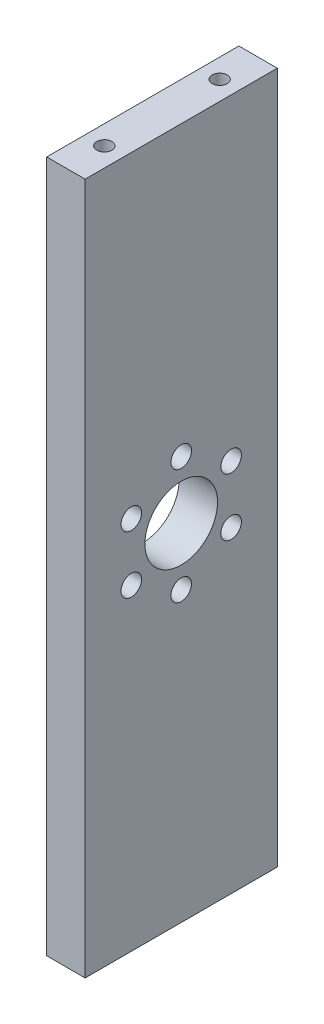
ISO-10303-21;
HEADER;
FILE_DESCRIPTION(('STEP AP214'),'2;1');
FILE_NAME('part.step','',(''),(''),'','','');
FILE_SCHEMA(('AUTOMOTIVE_DESIGN { 1 0 10303 214 1 1 1 1 }'));
ENDSEC;
DATA;
#1=APPLICATION_CONTEXT('core data for automotive mechanical design processes');
#2=APPLICATION_PROTOCOL_DEFINITION('international standard','automotive_design',2000,#1);
#3=PRODUCT_CONTEXT('',#1,'mechanical');
#4=PRODUCT('Part','Part','',(#3));
#5=PRODUCT_RELATED_PRODUCT_CATEGORY('part','',(#4));
#6=PRODUCT_DEFINITION_FORMATION('','',#4);
#7=PRODUCT_DEFINITION_CONTEXT('part definition',#1,'design');
#8=PRODUCT_DEFINITION('design','',#6,#7);
#9=PRODUCT_DEFINITION_SHAPE('','',#8);
#10=(LENGTH_UNIT() NAMED_UNIT(*) SI_UNIT(.MILLI.,.METRE.));
#11=(NAMED_UNIT(*) PLANE_ANGLE_UNIT() SI_UNIT($,.RADIAN.));
#12=(NAMED_UNIT(*) SI_UNIT($,.STERADIAN.) SOLID_ANGLE_UNIT());
#13=UNCERTAINTY_MEASURE_WITH_UNIT(LENGTH_MEASURE(1.E-05),#10,'distance_accuracy_value','');
#14=(GEOMETRIC_REPRESENTATION_CONTEXT(3) GLOBAL_UNCERTAINTY_ASSIGNED_CONTEXT((#13)) GLOBAL_UNIT_ASSIGNED_CONTEXT((#10,
#11,#12)) REPRESENTATION_CONTEXT('',''));
#15=CARTESIAN_POINT('',(0.,0.,0.));
#16=DIRECTION('',(0.,0.,1.));
#17=DIRECTION('',(1.,0.,0.));
#18=AXIS2_PLACEMENT_3D('',#15,#16,#17);
#19=CARTESIAN_POINT('',(3.175,-57.15,-15.875));
#20=DIRECTION('',(0.,0.,1.));
#21=DIRECTION('',(1.,0.,0.));
#22=AXIS2_PLACEMENT_3D('',#19,#20,#21);
#23=PLANE('',#22);
#24=DIRECTION('',(0.,1.,0.));
#25=VECTOR('',#24,1.);
#26=CARTESIAN_POINT('',(-3.175,-57.15,-15.875));
#27=LINE('',#26,#25);
#28=CARTESIAN_POINT('',(-3.175,-57.15,-15.875));
#29=VERTEX_POINT('',#28);
#30=CARTESIAN_POINT('',(-3.175,57.15,-15.875));
#31=VERTEX_POINT('',#30);
#32=EDGE_CURVE('E144',#29,#31,#27,.T.);
#33=ORIENTED_EDGE('',*,*,#32,.T.);
#34=DIRECTION('',(-1.,0.,0.));
#35=VECTOR('',#34,1.);
#36=CARTESIAN_POINT('',(3.175,57.15,-15.875));
#37=LINE('',#36,#35);
#38=CARTESIAN_POINT('',(3.175,57.15,-15.875));
#39=VERTEX_POINT('',#38);
#40=EDGE_CURVE('E11',#39,#31,#37,.T.);
#41=ORIENTED_EDGE('',*,*,#40,.F.);
#42=DIRECTION('',(0.,1.,0.));
#43=VECTOR('',#42,1.);
#44=CARTESIAN_POINT('',(3.175,-57.15,-15.875));
#45=LINE('',#44,#43);
#46=CARTESIAN_POINT('',(3.175,-57.15,-15.875));
#47=VERTEX_POINT('',#46);
#48=EDGE_CURVE('E145',#47,#39,#45,.T.);
#49=ORIENTED_EDGE('',*,*,#48,.F.);
#50=DIRECTION('',(-1.,0.,0.));
#51=VECTOR('',#50,1.);
#52=CARTESIAN_POINT('',(3.175,-57.15,-15.875));
#53=LINE('',#52,#51);
#54=EDGE_CURVE('E151',#47,#29,#53,.T.);
#55=ORIENTED_EDGE('',*,*,#54,.T.);
#56=EDGE_LOOP('',(#33,#41,#49,#55));
#57=FACE_BOUND('',#56,.T.);
#58=ADVANCED_FACE('F47',(#57),#23,.F.);
#59=CARTESIAN_POINT('',(3.175,57.15,15.875));
#60=DIRECTION('',(0.,-1.,0.));
#61=DIRECTION('',(0.,0.,-1.));
#62=AXIS2_PLACEMENT_3D('',#59,#60,#61);
#63=PLANE('',#62);
#64=CARTESIAN_POINT('',(0.,57.15,-9.525));
#65=DIRECTION('',(0.,1.,0.));
#66=DIRECTION('',(0.,0.,1.));
#67=AXIS2_PLACEMENT_3D('',#64,#65,#66);
#68=CIRCLE('',#67,1.25);
#69=CARTESIAN_POINT('',(0.,57.15,-8.275));
#70=VERTEX_POINT('',#69);
#71=EDGE_CURVE('E132',#70,#70,#68,.T.);
#72=ORIENTED_EDGE('',*,*,#71,.F.);
#73=EDGE_LOOP('',(#72));
#74=FACE_BOUND('',#73,.T.);
#75=CARTESIAN_POINT('',(0.,57.15,9.525));
#76=DIRECTION('',(0.,1.,0.));
#77=DIRECTION('',(0.,0.,1.));
#78=AXIS2_PLACEMENT_3D('',#75,#76,#77);
#79=CIRCLE('',#78,1.25);
#80=CARTESIAN_POINT('',(0.,57.15,10.775));
#81=VERTEX_POINT('',#80);
#82=EDGE_CURVE('E138',#81,#81,#79,.T.);
#83=ORIENTED_EDGE('',*,*,#82,.F.);
#84=EDGE_LOOP('',(#83));
#85=FACE_BOUND('',#84,.T.);
#86=DIRECTION('',(0.,0.,1.));
#87=VECTOR('',#86,1.);
#88=CARTESIAN_POINT('',(-3.175,57.15,15.875));
#89=LINE('',#88,#87);
#90=CARTESIAN_POINT('',(-3.175,57.15,15.875));
#91=VERTEX_POINT('',#90);
#92=EDGE_CURVE('E154',#31,#91,#89,.T.);
#93=ORIENTED_EDGE('',*,*,#92,.T.);
#94=DIRECTION('',(-1.,0.,0.));
#95=VECTOR('',#94,1.);
#96=CARTESIAN_POINT('',(3.175,57.15,15.875));
#97=LINE('',#96,#95);
#98=CARTESIAN_POINT('',(3.175,57.15,15.875));
#99=VERTEX_POINT('',#98);
#100=EDGE_CURVE('E56',#99,#91,#97,.T.);
#101=ORIENTED_EDGE('',*,*,#100,.F.);
#102=DIRECTION('',(0.,0.,1.));
#103=VECTOR('',#102,1.);
#104=CARTESIAN_POINT('',(3.175,57.15,15.875));
#105=LINE('',#104,#103);
#106=EDGE_CURVE('E96',#39,#99,#105,.T.);
#107=ORIENTED_EDGE('',*,*,#106,.F.);
#108=ORIENTED_EDGE('',*,*,#40,.T.);
#109=EDGE_LOOP('',(#93,#101,#107,#108));
#110=FACE_BOUND('',#109,.T.);
#111=ADVANCED_FACE('F251',(#74,#85,#110),#63,.F.);
#112=CARTESIAN_POINT('',(3.175,-57.15,15.875));
#113=DIRECTION('',(0.,0.,-1.));
#114=DIRECTION('',(-1.,0.,0.));
#115=AXIS2_PLACEMENT_3D('',#112,#113,#114);
#116=PLANE('',#115);
#117=DIRECTION('',(0.,-1.,0.));
#118=VECTOR('',#117,1.);
#119=CARTESIAN_POINT('',(-3.175,-57.15,15.875));
#120=LINE('',#119,#118);
#121=CARTESIAN_POINT('',(-3.175,-57.15,15.875));
#122=VERTEX_POINT('',#121);
#123=EDGE_CURVE('E83',#91,#122,#120,.T.);
#124=ORIENTED_EDGE('',*,*,#123,.T.);
#125=DIRECTION('',(-1.,0.,0.));
#126=VECTOR('',#125,1.);
#127=CARTESIAN_POINT('',(3.175,-57.15,15.875));
#128=LINE('',#127,#126);
#129=CARTESIAN_POINT('',(3.175,-57.15,15.875));
#130=VERTEX_POINT('',#129);
#131=EDGE_CURVE('E159',#130,#122,#128,.T.);
#132=ORIENTED_EDGE('',*,*,#131,.F.);
#133=DIRECTION('',(0.,-1.,0.));
#134=VECTOR('',#133,1.);
#135=CARTESIAN_POINT('',(3.175,-57.15,15.875));
#136=LINE('',#135,#134);
#137=EDGE_CURVE('E148',#99,#130,#136,.T.);
#138=ORIENTED_EDGE('',*,*,#137,.F.);
#139=ORIENTED_EDGE('',*,*,#100,.T.);
#140=EDGE_LOOP('',(#124,#132,#138,#139));
#141=FACE_BOUND('',#140,.T.);
#142=ADVANCED_FACE('F250',(#141),#116,.F.);
#143=CARTESIAN_POINT('',(3.175,-57.15,15.875));
#144=DIRECTION('',(0.,1.,0.));
#145=DIRECTION('',(0.,0.,1.));
#146=AXIS2_PLACEMENT_3D('',#143,#144,#145);
#147=PLANE('',#146);
#148=CARTESIAN_POINT('',(0.,-57.15,-9.525));
#149=DIRECTION('',(0.,-1.,0.));
#150=DIRECTION('',(0.,0.,-1.));
#151=AXIS2_PLACEMENT_3D('',#148,#149,#150);
#152=CIRCLE('',#151,1.25);
#153=CARTESIAN_POINT('',(0.,-57.15,-10.775));
#154=VERTEX_POINT('',#153);
#155=EDGE_CURVE('E120',#154,#154,#152,.T.);
#156=ORIENTED_EDGE('',*,*,#155,.F.);
#157=EDGE_LOOP('',(#156));
#158=FACE_BOUND('',#157,.T.);
#159=CARTESIAN_POINT('',(0.,-57.15,9.525));
#160=DIRECTION('',(0.,-1.,0.));
#161=DIRECTION('',(0.,0.,-1.));
#162=AXIS2_PLACEMENT_3D('',#159,#160,#161);
#163=CIRCLE('',#162,1.25);
#164=CARTESIAN_POINT('',(0.,-57.15,8.275));
#165=VERTEX_POINT('',#164);
#166=EDGE_CURVE('E119',#165,#165,#163,.T.);
#167=ORIENTED_EDGE('',*,*,#166,.F.);
#168=EDGE_LOOP('',(#167));
#169=FACE_BOUND('',#168,.T.);
#170=DIRECTION('',(0.,0.,-1.));
#171=VECTOR('',#170,1.);
#172=CARTESIAN_POINT('',(-3.175,-57.15,15.875));
#173=LINE('',#172,#171);
#174=EDGE_CURVE('E89',#122,#29,#173,.T.);
#175=ORIENTED_EDGE('',*,*,#174,.T.);
#176=ORIENTED_EDGE('',*,*,#54,.F.);
#177=DIRECTION('',(0.,0.,-1.));
#178=VECTOR('',#177,1.);
#179=CARTESIAN_POINT('',(3.175,-57.15,15.875));
#180=LINE('',#179,#178);
#181=EDGE_CURVE('E65',#130,#47,#180,.T.);
#182=ORIENTED_EDGE('',*,*,#181,.F.);
#183=ORIENTED_EDGE('',*,*,#131,.T.);
#184=EDGE_LOOP('',(#175,#176,#182,#183));
#185=FACE_BOUND('',#184,.T.);
#186=ADVANCED_FACE('F248',(#158,#169,#185),#147,.F.);
#187=CARTESIAN_POINT('',(3.175,0.,0.));
#188=DIRECTION('',(-1.,0.,0.));
#189=DIRECTION('',(0.,0.,1.));
#190=AXIS2_PLACEMENT_3D('',#187,#188,#189);
#191=PLANE('',#190);
#192=CARTESIAN_POINT('',(3.175,-4.76250000000013,8.24889197104677));
#193=DIRECTION('',(-1.,0.,0.));
#194=DIRECTION('',(0.,0.,1.));
#195=AXIS2_PLACEMENT_3D('',#192,#193,#194);
#196=CIRCLE('',#195,1.7);
#197=CARTESIAN_POINT('',(3.175,-4.76250000000013,9.94889197104677));
#198=VERTEX_POINT('',#197);
#199=EDGE_CURVE('E50',#198,#198,#196,.T.);
#200=ORIENTED_EDGE('',*,*,#199,.T.);
#201=EDGE_LOOP('',(#200));
#202=FACE_BOUND('',#201,.T.);
#203=CARTESIAN_POINT('',(3.175,4.76249999999982,8.2488919710468));
#204=DIRECTION('',(-1.,0.,0.));
#205=DIRECTION('',(0.,0.,1.));
#206=AXIS2_PLACEMENT_3D('',#203,#204,#205);
#207=CIRCLE('',#206,1.7);
#208=CARTESIAN_POINT('',(3.175,4.76249999999982,9.94889197104679));
#209=VERTEX_POINT('',#208);
#210=EDGE_CURVE('E181',#209,#209,#207,.T.);
#211=ORIENTED_EDGE('',*,*,#210,.T.);
#212=EDGE_LOOP('',(#211));
#213=FACE_BOUND('',#212,.T.);
#214=CARTESIAN_POINT('',(3.175,9.52500000000006,1.26704204273533E-13));
#215=DIRECTION('',(-1.,0.,0.));
#216=DIRECTION('',(0.,0.,1.));
#217=AXIS2_PLACEMENT_3D('',#214,#215,#216);
#218=CIRCLE('',#217,1.7);
#219=CARTESIAN_POINT('',(3.175,9.52500000000006,1.70000000000012));
#220=VERTEX_POINT('',#219);
#221=EDGE_CURVE('E177',#220,#220,#218,.T.);
#222=ORIENTED_EDGE('',*,*,#221,.T.);
#223=EDGE_LOOP('',(#222));
#224=FACE_BOUND('',#223,.T.);
#225=CARTESIAN_POINT('',(3.175,4.76249999999996,-8.24889197104677));
#226=DIRECTION('',(-1.,0.,0.));
#227=DIRECTION('',(0.,0.,1.));
#228=AXIS2_PLACEMENT_3D('',#225,#226,#227);
#229=CIRCLE('',#228,1.7);
#230=CARTESIAN_POINT('',(3.175,4.76249999999996,-6.54889197104677));
#231=VERTEX_POINT('',#230);
#232=EDGE_CURVE('E172',#231,#231,#229,.T.);
#233=ORIENTED_EDGE('',*,*,#232,.T.);
#234=EDGE_LOOP('',(#233));
#235=FACE_BOUND('',#234,.T.);
#236=CARTESIAN_POINT('',(3.175,-4.76249999999994,-8.24889197104695));
#237=DIRECTION('',(-1.,0.,0.));
#238=DIRECTION('',(0.,0.,1.));
#239=AXIS2_PLACEMENT_3D('',#236,#237,#238);
#240=CIRCLE('',#239,1.7);
#241=CARTESIAN_POINT('',(3.175,-4.76249999999994,-6.54889197104696));
#242=VERTEX_POINT('',#241);
#243=EDGE_CURVE('E167',#242,#242,#240,.T.);
#244=ORIENTED_EDGE('',*,*,#243,.T.);
#245=EDGE_LOOP('',(#244));
#246=FACE_BOUND('',#245,.T.);
#247=CARTESIAN_POINT('',(3.175,-9.5250000000001,-1.30902231909023E-13));
#248=DIRECTION('',(-1.,0.,0.));
#249=DIRECTION('',(0.,0.,1.));
#250=AXIS2_PLACEMENT_3D('',#247,#248,#249);
#251=CIRCLE('',#250,1.7);
#252=CARTESIAN_POINT('',(3.175,-9.5250000000001,1.69999999999987));
#253=VERTEX_POINT('',#252);
#254=EDGE_CURVE('E162',#253,#253,#251,.T.);
#255=ORIENTED_EDGE('',*,*,#254,.T.);
#256=EDGE_LOOP('',(#255));
#257=FACE_BOUND('',#256,.T.);
#258=CARTESIAN_POINT('',(3.175,-1.66539606842861E-13,0.));
#259=DIRECTION('',(-1.,0.,0.));
#260=DIRECTION('',(0.,0.,1.));
#261=AXIS2_PLACEMENT_3D('',#258,#259,#260);
#262=CIRCLE('',#261,6.);
#263=CARTESIAN_POINT('',(3.175,-1.66539606842861E-13,6.00000000000002));
#264=VERTEX_POINT('',#263);
#265=EDGE_CURVE('E126',#264,#264,#262,.T.);
#266=ORIENTED_EDGE('',*,*,#265,.T.);
#267=EDGE_LOOP('',(#266));
#268=FACE_BOUND('',#267,.T.);
#269=ORIENTED_EDGE('',*,*,#48,.T.);
#270=ORIENTED_EDGE('',*,*,#106,.T.);
#271=ORIENTED_EDGE('',*,*,#137,.T.);
#272=ORIENTED_EDGE('',*,*,#181,.T.);
#273=EDGE_LOOP('',(#269,#270,#271,#272));
#274=FACE_BOUND('',#273,.T.);
#275=ADVANCED_FACE('F229',(#202,#213,#224,#235,#246,#257,#268,#274),#191,.F.);
#276=CARTESIAN_POINT('',(-3.175,0.,0.));
#277=DIRECTION('',(-1.,0.,0.));
#278=DIRECTION('',(0.,0.,1.));
#279=AXIS2_PLACEMENT_3D('',#276,#277,#278);
#280=PLANE('',#279);
#281=CARTESIAN_POINT('',(-3.175,-4.76250000000013,8.24889197104677));
#282=DIRECTION('',(-1.,0.,0.));
#283=DIRECTION('',(0.,0.,1.));
#284=AXIS2_PLACEMENT_3D('',#281,#282,#283);
#285=CIRCLE('',#284,2.25);
#286=CARTESIAN_POINT('',(-3.175,-4.76250000000013,10.4988919710468));
#287=VERTEX_POINT('',#286);
#288=EDGE_CURVE('E370',#287,#287,#285,.T.);
#289=ORIENTED_EDGE('',*,*,#288,.F.);
#290=EDGE_LOOP('',(#289));
#291=FACE_BOUND('',#290,.T.);
#292=CARTESIAN_POINT('',(-3.175,4.76249999999982,8.2488919710468));
#293=DIRECTION('',(-1.,0.,0.));
#294=DIRECTION('',(0.,0.,1.));
#295=AXIS2_PLACEMENT_3D('',#292,#293,#294);
#296=CIRCLE('',#295,2.25);
#297=CARTESIAN_POINT('',(-3.175,4.76249999999982,10.4988919710468));
#298=VERTEX_POINT('',#297);
#299=EDGE_CURVE('E196',#298,#298,#296,.T.);
#300=ORIENTED_EDGE('',*,*,#299,.F.);
#301=EDGE_LOOP('',(#300));
#302=FACE_BOUND('',#301,.T.);
#303=CARTESIAN_POINT('',(-3.175,9.52500000000006,1.26704204273533E-13));
#304=DIRECTION('',(-1.,0.,0.));
#305=DIRECTION('',(0.,0.,1.));
#306=AXIS2_PLACEMENT_3D('',#303,#304,#305);
#307=CIRCLE('',#306,2.25);
#308=CARTESIAN_POINT('',(-3.175,9.52500000000006,2.25000000000012));
#309=VERTEX_POINT('',#308);
#310=EDGE_CURVE('E183',#309,#309,#307,.T.);
#311=ORIENTED_EDGE('',*,*,#310,.F.);
#312=EDGE_LOOP('',(#311));
#313=FACE_BOUND('',#312,.T.);
#314=CARTESIAN_POINT('',(-3.175,4.76249999999996,-8.24889197104677));
#315=DIRECTION('',(-1.,0.,0.));
#316=DIRECTION('',(0.,0.,1.));
#317=AXIS2_PLACEMENT_3D('',#314,#315,#316);
#318=CIRCLE('',#317,2.25);
#319=CARTESIAN_POINT('',(-3.175,4.76249999999996,-5.99889197104677));
#320=VERTEX_POINT('',#319);
#321=EDGE_CURVE('E179',#320,#320,#318,.T.);
#322=ORIENTED_EDGE('',*,*,#321,.F.);
#323=EDGE_LOOP('',(#322));
#324=FACE_BOUND('',#323,.T.);
#325=CARTESIAN_POINT('',(-3.175,-4.76249999999994,-8.24889197104695));
#326=DIRECTION('',(-1.,0.,0.));
#327=DIRECTION('',(0.,0.,1.));
#328=AXIS2_PLACEMENT_3D('',#325,#326,#327);
#329=CIRCLE('',#328,2.25);
#330=CARTESIAN_POINT('',(-3.175,-4.76249999999994,-5.99889197104696));
#331=VERTEX_POINT('',#330);
#332=EDGE_CURVE('E175',#331,#331,#329,.T.);
#333=ORIENTED_EDGE('',*,*,#332,.F.);
#334=EDGE_LOOP('',(#333));
#335=FACE_BOUND('',#334,.T.);
#336=CARTESIAN_POINT('',(-3.175,-9.5250000000001,-1.30902231909023E-13));
#337=DIRECTION('',(-1.,0.,0.));
#338=DIRECTION('',(0.,0.,1.));
#339=AXIS2_PLACEMENT_3D('',#336,#337,#338);
#340=CIRCLE('',#339,2.25);
#341=CARTESIAN_POINT('',(-3.175,-9.5250000000001,2.24999999999986));
#342=VERTEX_POINT('',#341);
#343=EDGE_CURVE('E170',#342,#342,#340,.T.);
#344=ORIENTED_EDGE('',*,*,#343,.F.);
#345=EDGE_LOOP('',(#344));
#346=FACE_BOUND('',#345,.T.);
#347=CARTESIAN_POINT('',(-3.175,-1.66539606842861E-13,0.));
#348=DIRECTION('',(-1.,0.,0.));
#349=DIRECTION('',(0.,0.,1.));
#350=AXIS2_PLACEMENT_3D('',#347,#348,#349);
#351=CIRCLE('',#350,5.99999999999999);
#352=CARTESIAN_POINT('',(-3.175,-1.66539606842861E-13,6.00000000000002));
#353=VERTEX_POINT('',#352);
#354=EDGE_CURVE('E165',#353,#353,#351,.T.);
#355=ORIENTED_EDGE('',*,*,#354,.F.);
#356=EDGE_LOOP('',(#355));
#357=FACE_BOUND('',#356,.T.);
#358=ORIENTED_EDGE('',*,*,#32,.F.);
#359=ORIENTED_EDGE('',*,*,#174,.F.);
#360=ORIENTED_EDGE('',*,*,#123,.F.);
#361=ORIENTED_EDGE('',*,*,#92,.F.);
#362=EDGE_LOOP('',(#358,#359,#360,#361));
#363=FACE_BOUND('',#362,.T.);
#364=ADVANCED_FACE('F238',(#291,#302,#313,#324,#335,#346,#357,#363),#280,.T.);
#365=CARTESIAN_POINT('',(0.,44.45,9.525));
#366=DIRECTION('',(0.,1.,0.));
#367=DIRECTION('',(0.,0.,1.));
#368=AXIS2_PLACEMENT_3D('',#365,#366,#367);
#369=CONICAL_SURFACE('',#368,1.25,1.02974425867665);
#370=CARTESIAN_POINT('',(0.,43.6989242262155,9.525));
#371=VERTEX_POINT('',#370);
#372=VERTEX_LOOP('',#371);
#373=FACE_BOUND('',#372,.T.);
#374=CARTESIAN_POINT('',(0.,44.45,9.525));
#375=DIRECTION('',(0.,1.,0.));
#376=DIRECTION('',(0.,0.,1.));
#377=AXIS2_PLACEMENT_3D('',#374,#375,#376);
#378=CIRCLE('',#377,1.25);
#379=CARTESIAN_POINT('',(0.,44.45,10.775));
#380=VERTEX_POINT('',#379);
#381=EDGE_CURVE('E141',#380,#380,#378,.T.);
#382=ORIENTED_EDGE('',*,*,#381,.T.);
#383=EDGE_LOOP('',(#382));
#384=FACE_BOUND('',#383,.T.);
#385=ADVANCED_FACE('F241',(#373,#384),#369,.F.);
#386=CARTESIAN_POINT('',(0.,57.15,9.525));
#387=DIRECTION('',(0.,1.,0.));
#388=DIRECTION('',(0.,0.,1.));
#389=AXIS2_PLACEMENT_3D('',#386,#387,#388);
#390=CYLINDRICAL_SURFACE('',#389,1.25);
#391=ORIENTED_EDGE('',*,*,#381,.F.);
#392=EDGE_LOOP('',(#391));
#393=FACE_BOUND('',#392,.T.);
#394=ORIENTED_EDGE('',*,*,#82,.T.);
#395=EDGE_LOOP('',(#394));
#396=FACE_BOUND('',#395,.T.);
#397=ADVANCED_FACE('F271',(#393,#396),#390,.F.);
#398=CARTESIAN_POINT('',(0.,44.45,-9.525));
#399=DIRECTION('',(0.,1.,0.));
#400=DIRECTION('',(0.,0.,1.));
#401=AXIS2_PLACEMENT_3D('',#398,#399,#400);
#402=CONICAL_SURFACE('',#401,1.25,1.02974425867665);
#403=CARTESIAN_POINT('',(0.,43.6989242262155,-9.525));
#404=VERTEX_POINT('',#403);
#405=VERTEX_LOOP('',#404);
#406=FACE_BOUND('',#405,.T.);
#407=CARTESIAN_POINT('',(0.,44.45,-9.525));
#408=DIRECTION('',(0.,1.,0.));
#409=DIRECTION('',(0.,0.,1.));
#410=AXIS2_PLACEMENT_3D('',#407,#408,#409);
#411=CIRCLE('',#410,1.25);
#412=CARTESIAN_POINT('',(0.,44.45,-8.275));
#413=VERTEX_POINT('',#412);
#414=EDGE_CURVE('E135',#413,#413,#411,.T.);
#415=ORIENTED_EDGE('',*,*,#414,.T.);
#416=EDGE_LOOP('',(#415));
#417=FACE_BOUND('',#416,.T.);
#418=ADVANCED_FACE('F275',(#406,#417),#402,.F.);
#419=CARTESIAN_POINT('',(0.,57.15,-9.525));
#420=DIRECTION('',(0.,1.,0.));
#421=DIRECTION('',(0.,0.,1.));
#422=AXIS2_PLACEMENT_3D('',#419,#420,#421);
#423=CYLINDRICAL_SURFACE('',#422,1.25);
#424=ORIENTED_EDGE('',*,*,#414,.F.);
#425=EDGE_LOOP('',(#424));
#426=FACE_BOUND('',#425,.T.);
#427=ORIENTED_EDGE('',*,*,#71,.T.);
#428=EDGE_LOOP('',(#427));
#429=FACE_BOUND('',#428,.T.);
#430=ADVANCED_FACE('F279',(#426,#429),#423,.F.);
#431=CARTESIAN_POINT('',(0.,-44.45,9.525));
#432=DIRECTION('',(0.,-1.,0.));
#433=DIRECTION('',(0.,0.,-1.));
#434=AXIS2_PLACEMENT_3D('',#431,#432,#433);
#435=CONICAL_SURFACE('',#434,1.25,1.02974425867665);
#436=CARTESIAN_POINT('',(0.,-43.6989242262155,9.525));
#437=VERTEX_POINT('',#436);
#438=VERTEX_LOOP('',#437);
#439=FACE_BOUND('',#438,.T.);
#440=CARTESIAN_POINT('',(0.,-44.45,9.525));
#441=DIRECTION('',(0.,-1.,0.));
#442=DIRECTION('',(0.,0.,-1.));
#443=AXIS2_PLACEMENT_3D('',#440,#441,#442);
#444=CIRCLE('',#443,1.25);
#445=CARTESIAN_POINT('',(0.,-44.45,8.275));
#446=VERTEX_POINT('',#445);
#447=EDGE_CURVE('E123',#446,#446,#444,.T.);
#448=ORIENTED_EDGE('',*,*,#447,.T.);
#449=EDGE_LOOP('',(#448));
#450=FACE_BOUND('',#449,.T.);
#451=ADVANCED_FACE('F283',(#439,#450),#435,.F.);
#452=CARTESIAN_POINT('',(0.,-57.15,9.525));
#453=DIRECTION('',(0.,-1.,0.));
#454=DIRECTION('',(0.,0.,-1.));
#455=AXIS2_PLACEMENT_3D('',#452,#453,#454);
#456=CYLINDRICAL_SURFACE('',#455,1.25);
#457=ORIENTED_EDGE('',*,*,#447,.F.);
#458=EDGE_LOOP('',(#457));
#459=FACE_BOUND('',#458,.T.);
#460=ORIENTED_EDGE('',*,*,#166,.T.);
#461=EDGE_LOOP('',(#460));
#462=FACE_BOUND('',#461,.T.);
#463=ADVANCED_FACE('F113',(#459,#462),#456,.F.);
#464=CARTESIAN_POINT('',(0.,-44.45,-9.525));
#465=DIRECTION('',(0.,-1.,0.));
#466=DIRECTION('',(0.,0.,-1.));
#467=AXIS2_PLACEMENT_3D('',#464,#465,#466);
#468=CONICAL_SURFACE('',#467,1.25,1.02974425867665);
#469=CARTESIAN_POINT('',(0.,-43.6989242262155,-9.525));
#470=VERTEX_POINT('',#469);
#471=VERTEX_LOOP('',#470);
#472=FACE_BOUND('',#471,.T.);
#473=CARTESIAN_POINT('',(0.,-44.45,-9.525));
#474=DIRECTION('',(0.,-1.,0.));
#475=DIRECTION('',(0.,0.,-1.));
#476=AXIS2_PLACEMENT_3D('',#473,#474,#475);
#477=CIRCLE('',#476,1.25);
#478=CARTESIAN_POINT('',(0.,-44.45,-10.775));
#479=VERTEX_POINT('',#478);
#480=EDGE_CURVE('E117',#479,#479,#477,.T.);
#481=ORIENTED_EDGE('',*,*,#480,.T.);
#482=EDGE_LOOP('',(#481));
#483=FACE_BOUND('',#482,.T.);
#484=ADVANCED_FACE('F109',(#472,#483),#468,.F.);
#485=CARTESIAN_POINT('',(0.,-57.15,-9.525));
#486=DIRECTION('',(0.,-1.,0.));
#487=DIRECTION('',(0.,0.,-1.));
#488=AXIS2_PLACEMENT_3D('',#485,#486,#487);
#489=CYLINDRICAL_SURFACE('',#488,1.25);
#490=ORIENTED_EDGE('',*,*,#480,.F.);
#491=EDGE_LOOP('',(#490));
#492=FACE_BOUND('',#491,.T.);
#493=ORIENTED_EDGE('',*,*,#155,.T.);
#494=EDGE_LOOP('',(#493));
#495=FACE_BOUND('',#494,.T.);
#496=ADVANCED_FACE('F112',(#492,#495),#489,.F.);
#497=CARTESIAN_POINT('',(-3.175,-1.66539606842861E-13,0.));
#498=DIRECTION('',(-1.,0.,0.));
#499=DIRECTION('',(0.,0.,1.));
#500=AXIS2_PLACEMENT_3D('',#497,#498,#499);
#501=CYLINDRICAL_SURFACE('',#500,5.99999999999999);
#502=ORIENTED_EDGE('',*,*,#265,.F.);
#503=EDGE_LOOP('',(#502));
#504=FACE_BOUND('',#503,.T.);
#505=ORIENTED_EDGE('',*,*,#354,.T.);
#506=EDGE_LOOP('',(#505));
#507=FACE_BOUND('',#506,.T.);
#508=ADVANCED_FACE('F231',(#504,#507),#501,.F.);
#509=CARTESIAN_POINT('',(-3.175,-9.5250000000001,-1.30902231909023E-13));
#510=DIRECTION('',(-1.,0.,0.));
#511=DIRECTION('',(0.,0.,1.));
#512=AXIS2_PLACEMENT_3D('',#509,#510,#511);
#513=CYLINDRICAL_SURFACE('',#512,1.7);
#514=CARTESIAN_POINT('',(-1.175,-9.5250000000001,-1.30902231909023E-13));
#515=DIRECTION('',(-1.,0.,0.));
#516=DIRECTION('',(0.,0.,1.));
#517=AXIS2_PLACEMENT_3D('',#514,#515,#516);
#518=CIRCLE('',#517,1.7);
#519=CARTESIAN_POINT('',(-1.175,-9.5250000000001,1.69999999999987));
#520=VERTEX_POINT('',#519);
#521=EDGE_CURVE('E166',#520,#520,#518,.T.);
#522=ORIENTED_EDGE('',*,*,#521,.T.);
#523=EDGE_LOOP('',(#522));
#524=FACE_BOUND('',#523,.T.);
#525=ORIENTED_EDGE('',*,*,#254,.F.);
#526=EDGE_LOOP('',(#525));
#527=FACE_BOUND('',#526,.T.);
#528=ADVANCED_FACE('F234',(#524,#527),#513,.F.);
#529=CARTESIAN_POINT('',(-1.175,-7.8250000000001,-1.30902231909023E-13));
#530=DIRECTION('',(1.,0.,0.));
#531=DIRECTION('',(0.,0.,-1.));
#532=AXIS2_PLACEMENT_3D('',#529,#530,#531);
#533=PLANE('',#532);
#534=ORIENTED_EDGE('',*,*,#521,.F.);
#535=EDGE_LOOP('',(#534));
#536=FACE_BOUND('',#535,.T.);
#537=CARTESIAN_POINT('',(-1.175,-9.5250000000001,-1.30902231909023E-13));
#538=DIRECTION('',(-1.,0.,0.));
#539=DIRECTION('',(0.,0.,1.));
#540=AXIS2_PLACEMENT_3D('',#537,#538,#539);
#541=CIRCLE('',#540,2.25);
#542=CARTESIAN_POINT('',(-1.175,-9.5250000000001,2.24999999999986));
#543=VERTEX_POINT('',#542);
#544=EDGE_CURVE('E220',#543,#543,#541,.T.);
#545=ORIENTED_EDGE('',*,*,#544,.T.);
#546=EDGE_LOOP('',(#545));
#547=FACE_BOUND('',#546,.T.);
#548=ADVANCED_FACE('F295',(#536,#547),#533,.F.);
#549=CARTESIAN_POINT('',(-3.175,-9.5250000000001,-1.30902231909023E-13));
#550=DIRECTION('',(-1.,0.,0.));
#551=DIRECTION('',(0.,0.,1.));
#552=AXIS2_PLACEMENT_3D('',#549,#550,#551);
#553=CYLINDRICAL_SURFACE('',#552,2.25);
#554=ORIENTED_EDGE('',*,*,#544,.F.);
#555=EDGE_LOOP('',(#554));
#556=FACE_BOUND('',#555,.T.);
#557=ORIENTED_EDGE('',*,*,#343,.T.);
#558=EDGE_LOOP('',(#557));
#559=FACE_BOUND('',#558,.T.);
#560=ADVANCED_FACE('F299',(#556,#559),#553,.F.);
#561=CARTESIAN_POINT('',(-3.175,-4.76249999999994,-8.24889197104695));
#562=DIRECTION('',(-1.,0.,0.));
#563=DIRECTION('',(0.,0.,1.));
#564=AXIS2_PLACEMENT_3D('',#561,#562,#563);
#565=CYLINDRICAL_SURFACE('',#564,1.7);
#566=CARTESIAN_POINT('',(-1.175,-4.76249999999994,-8.24889197104695));
#567=DIRECTION('',(-1.,0.,0.));
#568=DIRECTION('',(0.,0.,1.));
#569=AXIS2_PLACEMENT_3D('',#566,#567,#568);
#570=CIRCLE('',#569,1.7);
#571=CARTESIAN_POINT('',(-1.175,-4.76249999999994,-6.54889197104695));
#572=VERTEX_POINT('',#571);
#573=EDGE_CURVE('E171',#572,#572,#570,.T.);
#574=ORIENTED_EDGE('',*,*,#573,.T.);
#575=EDGE_LOOP('',(#574));
#576=FACE_BOUND('',#575,.T.);
#577=ORIENTED_EDGE('',*,*,#243,.F.);
#578=EDGE_LOOP('',(#577));
#579=FACE_BOUND('',#578,.T.);
#580=ADVANCED_FACE('F303',(#576,#579),#565,.F.);
#581=CARTESIAN_POINT('',(-1.175,-3.06249999999994,-8.24889197104695));
#582=DIRECTION('',(1.,0.,0.));
#583=DIRECTION('',(0.,0.,-1.));
#584=AXIS2_PLACEMENT_3D('',#581,#582,#583);
#585=PLANE('',#584);
#586=ORIENTED_EDGE('',*,*,#573,.F.);
#587=EDGE_LOOP('',(#586));
#588=FACE_BOUND('',#587,.T.);
#589=CARTESIAN_POINT('',(-1.175,-4.76249999999994,-8.24889197104695));
#590=DIRECTION('',(-1.,0.,0.));
#591=DIRECTION('',(0.,0.,1.));
#592=AXIS2_PLACEMENT_3D('',#589,#590,#591);
#593=CIRCLE('',#592,2.25);
#594=CARTESIAN_POINT('',(-1.175,-4.76249999999994,-5.99889197104696));
#595=VERTEX_POINT('',#594);
#596=EDGE_CURVE('E213',#595,#595,#593,.T.);
#597=ORIENTED_EDGE('',*,*,#596,.T.);
#598=EDGE_LOOP('',(#597));
#599=FACE_BOUND('',#598,.T.);
#600=ADVANCED_FACE('F307',(#588,#599),#585,.F.);
#601=CARTESIAN_POINT('',(-3.175,-4.76249999999994,-8.24889197104695));
#602=DIRECTION('',(-1.,0.,0.));
#603=DIRECTION('',(0.,0.,1.));
#604=AXIS2_PLACEMENT_3D('',#601,#602,#603);
#605=CYLINDRICAL_SURFACE('',#604,2.25);
#606=ORIENTED_EDGE('',*,*,#596,.F.);
#607=EDGE_LOOP('',(#606));
#608=FACE_BOUND('',#607,.T.);
#609=ORIENTED_EDGE('',*,*,#332,.T.);
#610=EDGE_LOOP('',(#609));
#611=FACE_BOUND('',#610,.T.);
#612=ADVANCED_FACE('F311',(#608,#611),#605,.F.);
#613=CARTESIAN_POINT('',(-3.175,4.76249999999996,-8.24889197104677));
#614=DIRECTION('',(-1.,0.,0.));
#615=DIRECTION('',(0.,0.,1.));
#616=AXIS2_PLACEMENT_3D('',#613,#614,#615);
#617=CYLINDRICAL_SURFACE('',#616,1.7);
#618=CARTESIAN_POINT('',(-1.175,4.76249999999996,-8.24889197104677));
#619=DIRECTION('',(-1.,0.,0.));
#620=DIRECTION('',(0.,0.,1.));
#621=AXIS2_PLACEMENT_3D('',#618,#619,#620);
#622=CIRCLE('',#621,1.7);
#623=CARTESIAN_POINT('',(-1.175,4.76249999999996,-6.54889197104677));
#624=VERTEX_POINT('',#623);
#625=EDGE_CURVE('E176',#624,#624,#622,.T.);
#626=ORIENTED_EDGE('',*,*,#625,.T.);
#627=EDGE_LOOP('',(#626));
#628=FACE_BOUND('',#627,.T.);
#629=ORIENTED_EDGE('',*,*,#232,.F.);
#630=EDGE_LOOP('',(#629));
#631=FACE_BOUND('',#630,.T.);
#632=ADVANCED_FACE('F315',(#628,#631),#617,.F.);
#633=CARTESIAN_POINT('',(-1.175,6.46249999999996,-8.24889197104677));
#634=DIRECTION('',(1.,0.,0.));
#635=DIRECTION('',(0.,0.,-1.));
#636=AXIS2_PLACEMENT_3D('',#633,#634,#635);
#637=PLANE('',#636);
#638=ORIENTED_EDGE('',*,*,#625,.F.);
#639=EDGE_LOOP('',(#638));
#640=FACE_BOUND('',#639,.T.);
#641=CARTESIAN_POINT('',(-1.175,4.76249999999996,-8.24889197104677));
#642=DIRECTION('',(-1.,0.,0.));
#643=DIRECTION('',(0.,0.,1.));
#644=AXIS2_PLACEMENT_3D('',#641,#642,#643);
#645=CIRCLE('',#644,2.25);
#646=CARTESIAN_POINT('',(-1.175,4.76249999999996,-5.99889197104677));
#647=VERTEX_POINT('',#646);
#648=EDGE_CURVE('E206',#647,#647,#645,.T.);
#649=ORIENTED_EDGE('',*,*,#648,.T.);
#650=EDGE_LOOP('',(#649));
#651=FACE_BOUND('',#650,.T.);
#652=ADVANCED_FACE('F319',(#640,#651),#637,.F.);
#653=CARTESIAN_POINT('',(-3.175,4.76249999999996,-8.24889197104677));
#654=DIRECTION('',(-1.,0.,0.));
#655=DIRECTION('',(0.,0.,1.));
#656=AXIS2_PLACEMENT_3D('',#653,#654,#655);
#657=CYLINDRICAL_SURFACE('',#656,2.25);
#658=ORIENTED_EDGE('',*,*,#648,.F.);
#659=EDGE_LOOP('',(#658));
#660=FACE_BOUND('',#659,.T.);
#661=ORIENTED_EDGE('',*,*,#321,.T.);
#662=EDGE_LOOP('',(#661));
#663=FACE_BOUND('',#662,.T.);
#664=ADVANCED_FACE('F323',(#660,#663),#657,.F.);
#665=CARTESIAN_POINT('',(-3.175,9.52500000000006,1.26704204273533E-13));
#666=DIRECTION('',(-1.,0.,0.));
#667=DIRECTION('',(0.,0.,1.));
#668=AXIS2_PLACEMENT_3D('',#665,#666,#667);
#669=CYLINDRICAL_SURFACE('',#668,1.7);
#670=CARTESIAN_POINT('',(-1.175,9.52500000000006,1.26704204273533E-13));
#671=DIRECTION('',(-1.,0.,0.));
#672=DIRECTION('',(0.,0.,1.));
#673=AXIS2_PLACEMENT_3D('',#670,#671,#672);
#674=CIRCLE('',#673,1.7);
#675=CARTESIAN_POINT('',(-1.175,9.52500000000006,1.70000000000012));
#676=VERTEX_POINT('',#675);
#677=EDGE_CURVE('E180',#676,#676,#674,.T.);
#678=ORIENTED_EDGE('',*,*,#677,.T.);
#679=EDGE_LOOP('',(#678));
#680=FACE_BOUND('',#679,.T.);
#681=ORIENTED_EDGE('',*,*,#221,.F.);
#682=EDGE_LOOP('',(#681));
#683=FACE_BOUND('',#682,.T.);
#684=ADVANCED_FACE('F327',(#680,#683),#669,.F.);
#685=CARTESIAN_POINT('',(-1.175,11.2250000000001,1.26704204273533E-13));
#686=DIRECTION('',(1.,0.,0.));
#687=DIRECTION('',(0.,0.,-1.));
#688=AXIS2_PLACEMENT_3D('',#685,#686,#687);
#689=PLANE('',#688);
#690=ORIENTED_EDGE('',*,*,#677,.F.);
#691=EDGE_LOOP('',(#690));
#692=FACE_BOUND('',#691,.T.);
#693=CARTESIAN_POINT('',(-1.175,9.52500000000006,1.26704204273533E-13));
#694=DIRECTION('',(-1.,0.,0.));
#695=DIRECTION('',(0.,0.,1.));
#696=AXIS2_PLACEMENT_3D('',#693,#694,#695);
#697=CIRCLE('',#696,2.25);
#698=CARTESIAN_POINT('',(-1.175,9.52500000000006,2.25000000000012));
#699=VERTEX_POINT('',#698);
#700=EDGE_CURVE('E188',#699,#699,#697,.T.);
#701=ORIENTED_EDGE('',*,*,#700,.T.);
#702=EDGE_LOOP('',(#701));
#703=FACE_BOUND('',#702,.T.);
#704=ADVANCED_FACE('F331',(#692,#703),#689,.F.);
#705=CARTESIAN_POINT('',(-3.175,9.52500000000006,1.26704204273533E-13));
#706=DIRECTION('',(-1.,0.,0.));
#707=DIRECTION('',(0.,0.,1.));
#708=AXIS2_PLACEMENT_3D('',#705,#706,#707);
#709=CYLINDRICAL_SURFACE('',#708,2.25);
#710=ORIENTED_EDGE('',*,*,#700,.F.);
#711=EDGE_LOOP('',(#710));
#712=FACE_BOUND('',#711,.T.);
#713=ORIENTED_EDGE('',*,*,#310,.T.);
#714=EDGE_LOOP('',(#713));
#715=FACE_BOUND('',#714,.T.);
#716=ADVANCED_FACE('F335',(#712,#715),#709,.F.);
#717=CARTESIAN_POINT('',(-3.175,4.76249999999982,8.2488919710468));
#718=DIRECTION('',(-1.,0.,0.));
#719=DIRECTION('',(0.,0.,1.));
#720=AXIS2_PLACEMENT_3D('',#717,#718,#719);
#721=CYLINDRICAL_SURFACE('',#720,1.7);
#722=CARTESIAN_POINT('',(-1.175,4.76249999999982,8.2488919710468));
#723=DIRECTION('',(-1.,0.,0.));
#724=DIRECTION('',(0.,0.,1.));
#725=AXIS2_PLACEMENT_3D('',#722,#723,#724);
#726=CIRCLE('',#725,1.7);
#727=CARTESIAN_POINT('',(-1.175,4.76249999999982,9.94889197104679));
#728=VERTEX_POINT('',#727);
#729=EDGE_CURVE('E184',#728,#728,#726,.T.);
#730=ORIENTED_EDGE('',*,*,#729,.T.);
#731=EDGE_LOOP('',(#730));
#732=FACE_BOUND('',#731,.T.);
#733=ORIENTED_EDGE('',*,*,#210,.F.);
#734=EDGE_LOOP('',(#733));
#735=FACE_BOUND('',#734,.T.);
#736=ADVANCED_FACE('F339',(#732,#735),#721,.F.);
#737=CARTESIAN_POINT('',(-1.175,6.46249999999982,8.2488919710468));
#738=DIRECTION('',(1.,0.,0.));
#739=DIRECTION('',(0.,0.,-1.));
#740=AXIS2_PLACEMENT_3D('',#737,#738,#739);
#741=PLANE('',#740);
#742=ORIENTED_EDGE('',*,*,#729,.F.);
#743=EDGE_LOOP('',(#742));
#744=FACE_BOUND('',#743,.T.);
#745=CARTESIAN_POINT('',(-1.175,4.76249999999982,8.2488919710468));
#746=DIRECTION('',(-1.,0.,0.));
#747=DIRECTION('',(0.,0.,1.));
#748=AXIS2_PLACEMENT_3D('',#745,#746,#747);
#749=CIRCLE('',#748,2.25);
#750=CARTESIAN_POINT('',(-1.175,4.76249999999982,10.4988919710468));
#751=VERTEX_POINT('',#750);
#752=EDGE_CURVE('E191',#751,#751,#749,.T.);
#753=ORIENTED_EDGE('',*,*,#752,.T.);
#754=EDGE_LOOP('',(#753));
#755=FACE_BOUND('',#754,.T.);
#756=ADVANCED_FACE('F343',(#744,#755),#741,.F.);
#757=CARTESIAN_POINT('',(-3.175,4.76249999999982,8.2488919710468));
#758=DIRECTION('',(-1.,0.,0.));
#759=DIRECTION('',(0.,0.,1.));
#760=AXIS2_PLACEMENT_3D('',#757,#758,#759);
#761=CYLINDRICAL_SURFACE('',#760,2.25);
#762=ORIENTED_EDGE('',*,*,#752,.F.);
#763=EDGE_LOOP('',(#762));
#764=FACE_BOUND('',#763,.T.);
#765=ORIENTED_EDGE('',*,*,#299,.T.);
#766=EDGE_LOOP('',(#765));
#767=FACE_BOUND('',#766,.T.);
#768=ADVANCED_FACE('F346',(#764,#767),#761,.F.);
#769=CARTESIAN_POINT('',(-3.175,-4.76250000000013,8.24889197104677));
#770=DIRECTION('',(-1.,0.,0.));
#771=DIRECTION('',(0.,0.,1.));
#772=AXIS2_PLACEMENT_3D('',#769,#770,#771);
#773=CYLINDRICAL_SURFACE('',#772,1.7);
#774=CARTESIAN_POINT('',(-1.175,-4.76250000000013,8.24889197104677));
#775=DIRECTION('',(-1.,0.,0.));
#776=DIRECTION('',(0.,0.,1.));
#777=AXIS2_PLACEMENT_3D('',#774,#775,#776);
#778=CIRCLE('',#777,1.7);
#779=CARTESIAN_POINT('',(-1.175,-4.76250000000013,9.94889197104677));
#780=VERTEX_POINT('',#779);
#781=EDGE_CURVE('E372',#780,#780,#778,.T.);
#782=ORIENTED_EDGE('',*,*,#781,.T.);
#783=EDGE_LOOP('',(#782));
#784=FACE_BOUND('',#783,.T.);
#785=ORIENTED_EDGE('',*,*,#199,.F.);
#786=EDGE_LOOP('',(#785));
#787=FACE_BOUND('',#786,.T.);
#788=ADVANCED_FACE('F350',(#784,#787),#773,.F.);
#789=CARTESIAN_POINT('',(-1.175,-3.06250000000014,8.24889197104677));
#790=DIRECTION('',(1.,0.,0.));
#791=DIRECTION('',(0.,0.,-1.));
#792=AXIS2_PLACEMENT_3D('',#789,#790,#791);
#793=PLANE('',#792);
#794=ORIENTED_EDGE('',*,*,#781,.F.);
#795=EDGE_LOOP('',(#794));
#796=FACE_BOUND('',#795,.T.);
#797=CARTESIAN_POINT('',(-1.175,-4.76250000000013,8.24889197104677));
#798=DIRECTION('',(-1.,0.,0.));
#799=DIRECTION('',(0.,0.,1.));
#800=AXIS2_PLACEMENT_3D('',#797,#798,#799);
#801=CIRCLE('',#800,2.25);
#802=CARTESIAN_POINT('',(-1.175,-4.76250000000013,10.4988919710468));
#803=VERTEX_POINT('',#802);
#804=EDGE_CURVE('E367',#803,#803,#801,.T.);
#805=ORIENTED_EDGE('',*,*,#804,.T.);
#806=EDGE_LOOP('',(#805));
#807=FACE_BOUND('',#806,.T.);
#808=ADVANCED_FACE('F354',(#796,#807),#793,.F.);
#809=CARTESIAN_POINT('',(-3.175,-4.76250000000013,8.24889197104677));
#810=DIRECTION('',(-1.,0.,0.));
#811=DIRECTION('',(0.,0.,1.));
#812=AXIS2_PLACEMENT_3D('',#809,#810,#811);
#813=CYLINDRICAL_SURFACE('',#812,2.25);
#814=ORIENTED_EDGE('',*,*,#804,.F.);
#815=EDGE_LOOP('',(#814));
#816=FACE_BOUND('',#815,.T.);
#817=ORIENTED_EDGE('',*,*,#288,.T.);
#818=EDGE_LOOP('',(#817));
#819=FACE_BOUND('',#818,.T.);
#820=ADVANCED_FACE('F358',(#816,#819),#813,.F.);
#821=CLOSED_SHELL('',(#58,#111,#142,#186,#275,#364,#385,#397,#418,#430,#451,#463,#484,#496,#508,
#528,#548,#560,#580,#600,#612,#632,#652,#664,#684,#704,#716,#736,#756,#768,#788,#808,#820));
#822=MANIFOLD_SOLID_BREP('B2',#821);
#823=ADVANCED_BREP_SHAPE_REPRESENTATION('',(#18,#822),#14);
#824=SHAPE_DEFINITION_REPRESENTATION(#9,#823);
ENDSEC;
END-ISO-10303-21;
